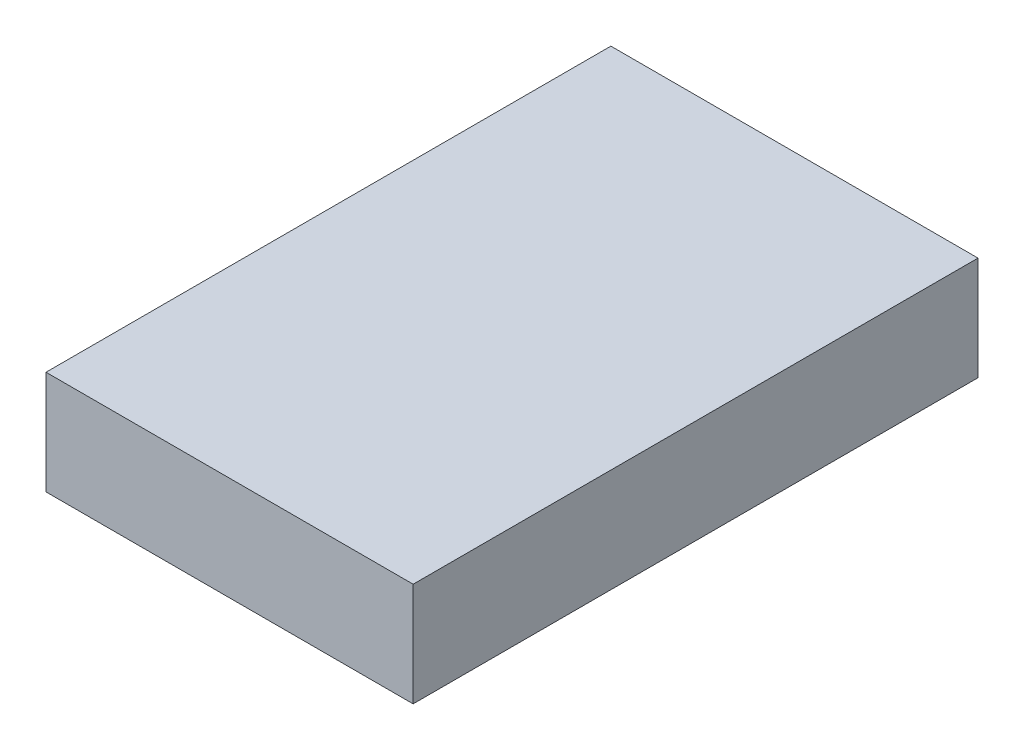
ISO-10303-21;
HEADER;
FILE_DESCRIPTION(('STEP AP214'),'2;1');
FILE_NAME('part.step','',(''),(''),'','','');
FILE_SCHEMA(('AUTOMOTIVE_DESIGN { 1 0 10303 214 1 1 1 1 }'));
ENDSEC;
DATA;
#1=APPLICATION_CONTEXT('core data for automotive mechanical design processes');
#2=APPLICATION_PROTOCOL_DEFINITION('international standard','automotive_design',2000,#1);
#3=PRODUCT_CONTEXT('',#1,'mechanical');
#4=PRODUCT('Part','Part','',(#3));
#5=PRODUCT_RELATED_PRODUCT_CATEGORY('part','',(#4));
#6=PRODUCT_DEFINITION_FORMATION('','',#4);
#7=PRODUCT_DEFINITION_CONTEXT('part definition',#1,'design');
#8=PRODUCT_DEFINITION('design','',#6,#7);
#9=PRODUCT_DEFINITION_SHAPE('','',#8);
#10=(LENGTH_UNIT() NAMED_UNIT(*) SI_UNIT(.MILLI.,.METRE.));
#11=(NAMED_UNIT(*) PLANE_ANGLE_UNIT() SI_UNIT($,.RADIAN.));
#12=(NAMED_UNIT(*) SI_UNIT($,.STERADIAN.) SOLID_ANGLE_UNIT());
#13=UNCERTAINTY_MEASURE_WITH_UNIT(LENGTH_MEASURE(1.E-05),#10,'distance_accuracy_value','');
#14=(GEOMETRIC_REPRESENTATION_CONTEXT(3) GLOBAL_UNCERTAINTY_ASSIGNED_CONTEXT((#13)) GLOBAL_UNIT_ASSIGNED_CONTEXT((#10,
#11,#12)) REPRESENTATION_CONTEXT('',''));
#15=CARTESIAN_POINT('',(0.,0.,0.));
#16=DIRECTION('',(0.,0.,1.));
#17=DIRECTION('',(1.,0.,0.));
#18=AXIS2_PLACEMENT_3D('',#15,#16,#17);
#19=CARTESIAN_POINT('',(0.543454166666667,36.7000028,199.409733683333));
#20=DIRECTION('',(-1.,0.,0.));
#21=DIRECTION('',(0.,0.,1.));
#22=AXIS2_PLACEMENT_3D('',#19,#20,#21);
#23=PLANE('',#22);
#24=DIRECTION('',(0.,0.,-1.));
#25=VECTOR('',#24,1.);
#26=CARTESIAN_POINT('',(0.543454166666667,0.,199.409733683333));
#27=LINE('',#26,#25);
#28=CARTESIAN_POINT('',(0.543454166666667,0.,199.409733683333));
#29=VERTEX_POINT('',#28);
#30=CARTESIAN_POINT('',(0.543454166666667,0.,-0.595047916666666));
#31=VERTEX_POINT('',#30);
#32=EDGE_CURVE('E107',#29,#31,#27,.T.);
#33=ORIENTED_EDGE('',*,*,#32,.T.);
#34=DIRECTION('',(0.,-1.,0.));
#35=VECTOR('',#34,1.);
#36=CARTESIAN_POINT('',(0.543454166666667,36.7000028,-0.595047916666666));
#37=LINE('',#36,#35);
#38=CARTESIAN_POINT('',(0.543454166666667,36.7000028,-0.595047916666666));
#39=VERTEX_POINT('',#38);
#40=EDGE_CURVE('E11',#39,#31,#37,.T.);
#41=ORIENTED_EDGE('',*,*,#40,.F.);
#42=DIRECTION('',(0.,0.,-1.));
#43=VECTOR('',#42,1.);
#44=CARTESIAN_POINT('',(0.543454166666667,36.7000028,199.409733683333));
#45=LINE('',#44,#43);
#46=CARTESIAN_POINT('',(0.543454166666667,36.7000028,199.409733683333));
#47=VERTEX_POINT('',#46);
#48=EDGE_CURVE('E91',#47,#39,#45,.T.);
#49=ORIENTED_EDGE('',*,*,#48,.F.);
#50=DIRECTION('',(0.,-1.,0.));
#51=VECTOR('',#50,1.);
#52=CARTESIAN_POINT('',(0.543454166666667,36.7000028,199.409733683333));
#53=LINE('',#52,#51);
#54=EDGE_CURVE('E103',#47,#29,#53,.T.);
#55=ORIENTED_EDGE('',*,*,#54,.T.);
#56=EDGE_LOOP('',(#33,#41,#49,#55));
#57=FACE_BOUND('',#56,.T.);
#58=ADVANCED_FACE('F39',(#57),#23,.F.);
#59=CARTESIAN_POINT('',(-129.456285833333,36.7000028,-0.595047916666666));
#60=DIRECTION('',(0.,0.,1.));
#61=DIRECTION('',(1.,0.,0.));
#62=AXIS2_PLACEMENT_3D('',#59,#60,#61);
#63=PLANE('',#62);
#64=DIRECTION('',(-1.,0.,0.));
#65=VECTOR('',#64,1.);
#66=CARTESIAN_POINT('',(-129.456285833333,0.,-0.595047916666666));
#67=LINE('',#66,#65);
#68=CARTESIAN_POINT('',(-129.456285833333,0.,-0.595047916666666));
#69=VERTEX_POINT('',#68);
#70=EDGE_CURVE('E96',#31,#69,#67,.T.);
#71=ORIENTED_EDGE('',*,*,#70,.T.);
#72=DIRECTION('',(0.,-1.,0.));
#73=VECTOR('',#72,1.);
#74=CARTESIAN_POINT('',(-129.456285833333,36.7000028,-0.595047916666666));
#75=LINE('',#74,#73);
#76=CARTESIAN_POINT('',(-129.456285833333,36.7000028,-0.595047916666666));
#77=VERTEX_POINT('',#76);
#78=EDGE_CURVE('E48',#77,#69,#75,.T.);
#79=ORIENTED_EDGE('',*,*,#78,.F.);
#80=DIRECTION('',(-1.,0.,0.));
#81=VECTOR('',#80,1.);
#82=CARTESIAN_POINT('',(-129.456285833333,36.7000028,-0.595047916666666));
#83=LINE('',#82,#81);
#84=EDGE_CURVE('E86',#39,#77,#83,.T.);
#85=ORIENTED_EDGE('',*,*,#84,.F.);
#86=ORIENTED_EDGE('',*,*,#40,.T.);
#87=EDGE_LOOP('',(#71,#79,#85,#86));
#88=FACE_BOUND('',#87,.T.);
#89=ADVANCED_FACE('F95',(#88),#63,.F.);
#90=CARTESIAN_POINT('',(-129.456285833333,36.7000028,199.409733683333));
#91=DIRECTION('',(1.,0.,0.));
#92=DIRECTION('',(0.,0.,-1.));
#93=AXIS2_PLACEMENT_3D('',#90,#91,#92);
#94=PLANE('',#93);
#95=DIRECTION('',(0.,0.,1.));
#96=VECTOR('',#95,1.);
#97=CARTESIAN_POINT('',(-129.456285833333,0.,199.409733683333));
#98=LINE('',#97,#96);
#99=CARTESIAN_POINT('',(-129.456285833333,0.,199.409733683333));
#100=VERTEX_POINT('',#99);
#101=EDGE_CURVE('E73',#69,#100,#98,.T.);
#102=ORIENTED_EDGE('',*,*,#101,.T.);
#103=DIRECTION('',(0.,-1.,0.));
#104=VECTOR('',#103,1.);
#105=CARTESIAN_POINT('',(-129.456285833333,36.7000028,199.409733683333));
#106=LINE('',#105,#104);
#107=CARTESIAN_POINT('',(-129.456285833333,36.7000028,199.409733683333));
#108=VERTEX_POINT('',#107);
#109=EDGE_CURVE('E98',#108,#100,#106,.T.);
#110=ORIENTED_EDGE('',*,*,#109,.F.);
#111=DIRECTION('',(0.,0.,1.));
#112=VECTOR('',#111,1.);
#113=CARTESIAN_POINT('',(-129.456285833333,36.7000028,199.409733683333));
#114=LINE('',#113,#112);
#115=EDGE_CURVE('E89',#77,#108,#114,.T.);
#116=ORIENTED_EDGE('',*,*,#115,.F.);
#117=ORIENTED_EDGE('',*,*,#78,.T.);
#118=EDGE_LOOP('',(#102,#110,#116,#117));
#119=FACE_BOUND('',#118,.T.);
#120=ADVANCED_FACE('F99',(#119),#94,.F.);
#121=CARTESIAN_POINT('',(-129.456285833333,36.7000028,199.409733683333));
#122=DIRECTION('',(0.,0.,-1.));
#123=DIRECTION('',(-1.,0.,0.));
#124=AXIS2_PLACEMENT_3D('',#121,#122,#123);
#125=PLANE('',#124);
#126=DIRECTION('',(1.,0.,0.));
#127=VECTOR('',#126,1.);
#128=CARTESIAN_POINT('',(-129.456285833333,0.,199.409733683333));
#129=LINE('',#128,#127);
#130=EDGE_CURVE('E79',#100,#29,#129,.T.);
#131=ORIENTED_EDGE('',*,*,#130,.T.);
#132=ORIENTED_EDGE('',*,*,#54,.F.);
#133=DIRECTION('',(1.,0.,0.));
#134=VECTOR('',#133,1.);
#135=CARTESIAN_POINT('',(-129.456285833333,36.7000028,199.409733683333));
#136=LINE('',#135,#134);
#137=EDGE_CURVE('E56',#108,#47,#136,.T.);
#138=ORIENTED_EDGE('',*,*,#137,.F.);
#139=ORIENTED_EDGE('',*,*,#109,.T.);
#140=EDGE_LOOP('',(#131,#132,#138,#139));
#141=FACE_BOUND('',#140,.T.);
#142=ADVANCED_FACE('F120',(#141),#125,.F.);
#143=CARTESIAN_POINT('',(0.,36.7000028,0.));
#144=DIRECTION('',(0.,-1.,0.));
#145=DIRECTION('',(0.,0.,-1.));
#146=AXIS2_PLACEMENT_3D('',#143,#144,#145);
#147=PLANE('',#146);
#148=ORIENTED_EDGE('',*,*,#48,.T.);
#149=ORIENTED_EDGE('',*,*,#84,.T.);
#150=ORIENTED_EDGE('',*,*,#115,.T.);
#151=ORIENTED_EDGE('',*,*,#137,.T.);
#152=EDGE_LOOP('',(#148,#149,#150,#151));
#153=FACE_BOUND('',#152,.T.);
#154=ADVANCED_FACE('F87',(#153),#147,.F.);
#155=CARTESIAN_POINT('',(0.,0.,0.));
#156=DIRECTION('',(0.,-1.,0.));
#157=DIRECTION('',(0.,0.,-1.));
#158=AXIS2_PLACEMENT_3D('',#155,#156,#157);
#159=PLANE('',#158);
#160=ORIENTED_EDGE('',*,*,#32,.F.);
#161=ORIENTED_EDGE('',*,*,#130,.F.);
#162=ORIENTED_EDGE('',*,*,#101,.F.);
#163=ORIENTED_EDGE('',*,*,#70,.F.);
#164=EDGE_LOOP('',(#160,#161,#162,#163));
#165=FACE_BOUND('',#164,.T.);
#166=ADVANCED_FACE('F123',(#165),#159,.T.);
#167=CLOSED_SHELL('',(#58,#89,#120,#142,#154,#166));
#168=MANIFOLD_SOLID_BREP('B2',#167);
#169=ADVANCED_BREP_SHAPE_REPRESENTATION('',(#18,#168),#14);
#170=SHAPE_DEFINITION_REPRESENTATION(#9,#169);
ENDSEC;
END-ISO-10303-21;
